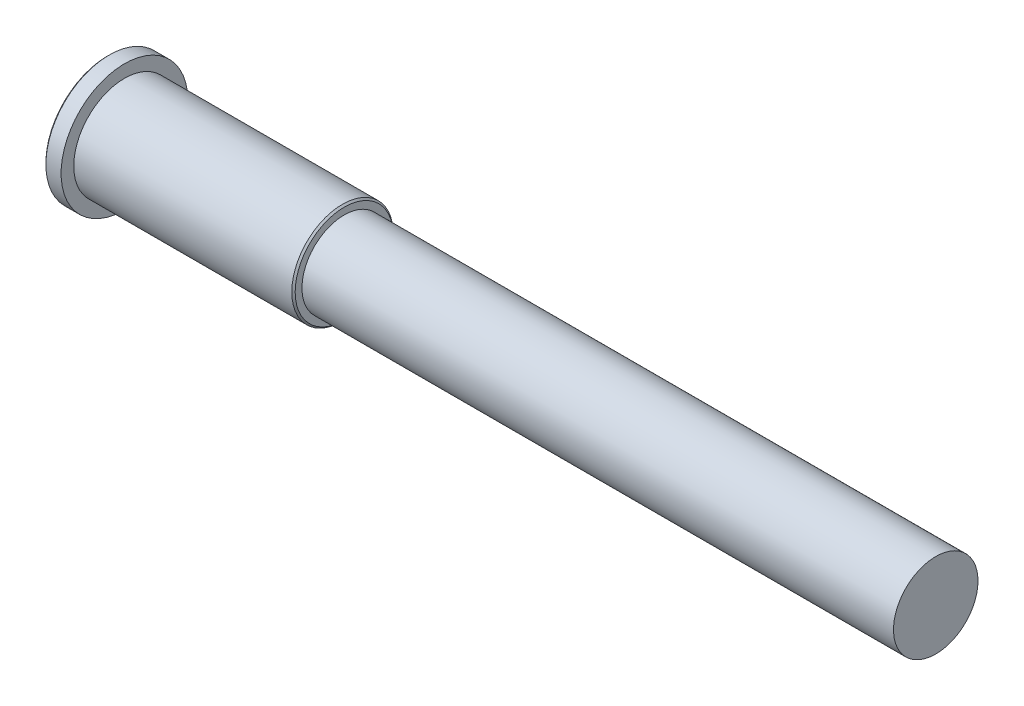
ISO-10303-21;
HEADER;
FILE_DESCRIPTION(('STEP AP214'),'2;1');
FILE_NAME('part.step','',(''),(''),'','','');
FILE_SCHEMA(('AUTOMOTIVE_DESIGN { 1 0 10303 214 1 1 1 1 }'));
ENDSEC;
DATA;
#1=APPLICATION_CONTEXT('core data for automotive mechanical design processes');
#2=APPLICATION_PROTOCOL_DEFINITION('international standard','automotive_design',2000,#1);
#3=PRODUCT_CONTEXT('',#1,'mechanical');
#4=PRODUCT('Part','Part','',(#3));
#5=PRODUCT_RELATED_PRODUCT_CATEGORY('part','',(#4));
#6=PRODUCT_DEFINITION_FORMATION('','',#4);
#7=PRODUCT_DEFINITION_CONTEXT('part definition',#1,'design');
#8=PRODUCT_DEFINITION('design','',#6,#7);
#9=PRODUCT_DEFINITION_SHAPE('','',#8);
#10=(LENGTH_UNIT() NAMED_UNIT(*) SI_UNIT(.MILLI.,.METRE.));
#11=(NAMED_UNIT(*) PLANE_ANGLE_UNIT() SI_UNIT($,.RADIAN.));
#12=(NAMED_UNIT(*) SI_UNIT($,.STERADIAN.) SOLID_ANGLE_UNIT());
#13=UNCERTAINTY_MEASURE_WITH_UNIT(LENGTH_MEASURE(1.E-05),#10,'distance_accuracy_value','');
#14=(GEOMETRIC_REPRESENTATION_CONTEXT(3) GLOBAL_UNCERTAINTY_ASSIGNED_CONTEXT((#13)) GLOBAL_UNIT_ASSIGNED_CONTEXT((#10,
#11,#12)) REPRESENTATION_CONTEXT('',''));
#15=CARTESIAN_POINT('',(0.,0.,0.));
#16=DIRECTION('',(0.,0.,1.));
#17=DIRECTION('',(1.,0.,0.));
#18=AXIS2_PLACEMENT_3D('',#15,#16,#17);
#19=CARTESIAN_POINT('',(30.9757691467533,0.,0.));
#20=DIRECTION('',(-1.,0.,0.));
#21=DIRECTION('',(0.,0.,1.));
#22=AXIS2_PLACEMENT_3D('',#19,#20,#21);
#23=CYLINDRICAL_SURFACE('',#22,2.381739130425);
#24=CARTESIAN_POINT('',(30.4041517554513,0.,0.));
#25=DIRECTION('',(1.,0.,0.));
#26=DIRECTION('',(0.,0.,-1.));
#27=AXIS2_PLACEMENT_3D('',#24,#25,#26);
#28=CIRCLE('',#27,2.381739130425);
#29=CARTESIAN_POINT('',(30.4041517554513,0.,-2.381739130425));
#30=VERTEX_POINT('',#29);
#31=EDGE_CURVE('E53',#30,#30,#28,.T.);
#32=ORIENTED_EDGE('',*,*,#31,.T.);
#33=EDGE_LOOP('',(#32));
#34=FACE_BOUND('',#33,.T.);
#35=CARTESIAN_POINT('',(30.9757691467533,0.,0.));
#36=DIRECTION('',(1.,0.,0.));
#37=DIRECTION('',(0.,0.,-1.));
#38=AXIS2_PLACEMENT_3D('',#35,#36,#37);
#39=CIRCLE('',#38,2.381739130425);
#40=CARTESIAN_POINT('',(30.9757691467533,0.,-2.381739130425));
#41=VERTEX_POINT('',#40);
#42=EDGE_CURVE('E59',#41,#41,#39,.T.);
#43=ORIENTED_EDGE('',*,*,#42,.F.);
#44=EDGE_LOOP('',(#43));
#45=FACE_BOUND('',#44,.T.);
#46=ADVANCED_FACE('F38',(#34,#45),#23,.T.);
#47=CARTESIAN_POINT('',(30.9757691467533,0.,0.));
#48=DIRECTION('',(1.,0.,0.));
#49=DIRECTION('',(0.,0.,-1.));
#50=AXIS2_PLACEMENT_3D('',#47,#48,#49);
#51=PLANE('',#50);
#52=CARTESIAN_POINT('',(30.9757691467533,0.,0.));
#53=DIRECTION('',(1.,0.,0.));
#54=DIRECTION('',(0.,0.,-1.));
#55=AXIS2_PLACEMENT_3D('',#52,#53,#54);
#56=CIRCLE('',#55,1.90539130434);
#57=CARTESIAN_POINT('',(30.9757691467533,0.,1.90539130434));
#58=VERTEX_POINT('',#57);
#59=EDGE_CURVE('E62',#58,#58,#56,.T.);
#60=ORIENTED_EDGE('',*,*,#59,.F.);
#61=EDGE_LOOP('',(#60));
#62=FACE_BOUND('',#61,.T.);
#63=ORIENTED_EDGE('',*,*,#42,.T.);
#64=EDGE_LOOP('',(#63));
#65=FACE_BOUND('',#64,.T.);
#66=ADVANCED_FACE('F89',(#62,#65),#51,.T.);
#67=CARTESIAN_POINT('',(30.3406387119733,0.,0.));
#68=DIRECTION('',(1.,0.,0.));
#69=DIRECTION('',(0.,0.,-1.));
#70=AXIS2_PLACEMENT_3D('',#67,#68,#69);
#71=PLANE('',#70);
#72=CARTESIAN_POINT('',(30.3406387119733,0.,0.));
#73=DIRECTION('',(1.,0.,0.));
#74=DIRECTION('',(0.,0.,-1.));
#75=AXIS2_PLACEMENT_3D('',#72,#73,#74);
#76=CIRCLE('',#75,2.318226086947);
#77=CARTESIAN_POINT('',(30.3406387119733,0.,-2.31822608694699));
#78=VERTEX_POINT('',#77);
#79=EDGE_CURVE('E49',#78,#78,#76,.F.);
#80=ORIENTED_EDGE('',*,*,#79,.T.);
#81=EDGE_LOOP('',(#80));
#82=FACE_BOUND('',#81,.T.);
#83=ADVANCED_FACE('F86',(#82),#71,.F.);
#84=CARTESIAN_POINT('',(39.2324647988933,0.,0.));
#85=DIRECTION('',(-1.,0.,0.));
#86=DIRECTION('',(0.,0.,1.));
#87=AXIS2_PLACEMENT_3D('',#84,#85,#86);
#88=CYLINDRICAL_SURFACE('',#87,1.90539130434);
#89=CARTESIAN_POINT('',(39.1689517554154,0.,0.));
#90=DIRECTION('',(1.,0.,0.));
#91=DIRECTION('',(0.,0.,-1.));
#92=AXIS2_PLACEMENT_3D('',#89,#90,#91);
#93=CIRCLE('',#92,1.90539130434);
#94=CARTESIAN_POINT('',(39.1689517554154,0.,1.90539130434));
#95=VERTEX_POINT('',#94);
#96=EDGE_CURVE('E10',#95,#95,#93,.F.);
#97=CARTESIAN_POINT('',(39.1689517554154,0.,1.90539130434));
#98=CARTESIAN_POINT('',(39.0836061032418,0.,1.90539130434));
#99=CARTESIAN_POINT('',(38.9982604510682,0.,1.90539130434));
#100=CARTESIAN_POINT('',(38.8275691467211,0.,1.90539130434));
#101=CARTESIAN_POINT('',(38.7422234945475,0.,1.90539130434));
#102=CARTESIAN_POINT('',(38.5715321902004,0.,1.90539130434));
#103=CARTESIAN_POINT('',(38.4861865380269,0.,1.90539130434));
#104=CARTESIAN_POINT('',(38.3154952336797,0.,1.90539130434));
#105=CARTESIAN_POINT('',(38.2301495815062,0.,1.90539130434));
#106=CARTESIAN_POINT('',(38.059458277159,0.,1.90539130434));
#107=CARTESIAN_POINT('',(37.9741126249855,0.,1.90539130434));
#108=CARTESIAN_POINT('',(37.8034213206383,0.,1.90539130434));
#109=CARTESIAN_POINT('',(37.7180756684648,0.,1.90539130434));
#110=CARTESIAN_POINT('',(37.5473843641177,0.,1.90539130434));
#111=CARTESIAN_POINT('',(37.4620387119441,0.,1.90539130434));
#112=CARTESIAN_POINT('',(37.291347407597,0.,1.90539130434));
#113=CARTESIAN_POINT('',(37.2060017554234,0.,1.90539130434));
#114=CARTESIAN_POINT('',(37.0353104510763,0.,1.90539130434));
#115=CARTESIAN_POINT('',(36.9499647989027,0.,1.90539130434));
#116=CARTESIAN_POINT('',(36.7792734945556,0.,1.90539130434));
#117=CARTESIAN_POINT('',(36.693927842382,0.,1.90539130434));
#118=CARTESIAN_POINT('',(36.5232365380349,0.,1.90539130434));
#119=CARTESIAN_POINT('',(36.4378908858613,0.,1.90539130434));
#120=CARTESIAN_POINT('',(36.2671995815142,0.,1.90539130434));
#121=CARTESIAN_POINT('',(36.1818539293407,0.,1.90539130434));
#122=CARTESIAN_POINT('',(36.0111626249935,0.,1.90539130434));
#123=CARTESIAN_POINT('',(35.92581697282,0.,1.90539130434));
#124=CARTESIAN_POINT('',(35.7551256684729,0.,1.90539130434));
#125=CARTESIAN_POINT('',(35.6697800162993,0.,1.90539130434));
#126=CARTESIAN_POINT('',(35.4990887119522,0.,1.90539130434));
#127=CARTESIAN_POINT('',(35.4137430597786,0.,1.90539130434));
#128=CARTESIAN_POINT('',(35.2430517554315,0.,1.90539130434));
#129=CARTESIAN_POINT('',(35.1577061032579,0.,1.90539130434));
#130=CARTESIAN_POINT('',(34.9870147989108,0.,1.90539130434));
#131=CARTESIAN_POINT('',(34.9016691467372,0.,1.90539130434));
#132=CARTESIAN_POINT('',(34.7309778423901,0.,1.90539130434));
#133=CARTESIAN_POINT('',(34.6456321902165,0.,1.90539130434));
#134=CARTESIAN_POINT('',(34.4749408858694,0.,1.90539130434));
#135=CARTESIAN_POINT('',(34.3895952336959,0.,1.90539130434));
#136=CARTESIAN_POINT('',(34.2189039293487,0.,1.90539130434));
#137=CARTESIAN_POINT('',(34.1335582771752,0.,1.90539130434));
#138=CARTESIAN_POINT('',(33.962866972828,0.,1.90539130434));
#139=CARTESIAN_POINT('',(33.8775213206545,0.,1.90539130434));
#140=CARTESIAN_POINT('',(33.7068300163073,0.,1.90539130434));
#141=CARTESIAN_POINT('',(33.6214843641338,0.,1.90539130434));
#142=CARTESIAN_POINT('',(33.4507930597867,0.,1.90539130434));
#143=CARTESIAN_POINT('',(33.3654474076131,0.,1.90539130434));
#144=CARTESIAN_POINT('',(33.194756103266,0.,1.90539130434));
#145=CARTESIAN_POINT('',(33.1094104510924,0.,1.90539130434));
#146=CARTESIAN_POINT('',(32.9387191467453,0.,1.90539130434));
#147=CARTESIAN_POINT('',(32.8533734945717,0.,1.90539130434));
#148=CARTESIAN_POINT('',(32.6826821902246,0.,1.90539130434));
#149=CARTESIAN_POINT('',(32.597336538051,0.,1.90539130434));
#150=CARTESIAN_POINT('',(32.4266452337039,0.,1.90539130434));
#151=CARTESIAN_POINT('',(32.3412995815303,0.,1.90539130434));
#152=CARTESIAN_POINT('',(32.1706082771832,0.,1.90539130434));
#153=CARTESIAN_POINT('',(32.0852626250097,0.,1.90539130434));
#154=CARTESIAN_POINT('',(31.9145713206625,0.,1.90539130434));
#155=CARTESIAN_POINT('',(31.829225668489,0.,1.90539130434));
#156=CARTESIAN_POINT('',(31.6585343641418,0.,1.90539130434));
#157=CARTESIAN_POINT('',(31.5731887119683,0.,1.90539130434));
#158=CARTESIAN_POINT('',(31.4024974076211,0.,1.90539130434));
#159=CARTESIAN_POINT('',(31.3171517554476,0.,1.90539130434));
#160=CARTESIAN_POINT('',(31.1464604511005,0.,1.90539130434));
#161=CARTESIAN_POINT('',(31.0611147989269,0.,1.90539130434));
#162=CARTESIAN_POINT('',(30.9757691467533,0.,1.90539130434));
#163=B_SPLINE_CURVE_WITH_KNOTS('',3,(#97,#98,#99,#100,#101,#102,#103,#104,#105,#106,#107,#108,
#109,#110,#111,#112,#113,#114,#115,#116,#117,#118,#119,#120,#121,#122,#123,#124,#125,#126,#127,
#128,#129,#130,#131,#132,#133,#134,#135,#136,#137,#138,#139,#140,#141,#142,#143,#144,#145,#146,
#147,#148,#149,#150,#151,#152,#153,#154,#155,#156,#157,#158,#159,#160,#161,#162),.UNSPECIFIED.,
.F.,.F.,(4,2,2,2,2,2,2,2,2,2,2,2,2,2,2,2,2,2,2,2,2,2,2,2,2,2,2,2,2,2,2,2,4),(0.,
0.256036956520683,0.512073913041373,0.768110869562064,1.02414782608275,1.28018478260344,
1.53622173912413,1.79225869564482,2.0482956521655,2.30433260868619,2.56036956520688,
2.81640652172756,3.07244347824825,3.32848043476894,3.58451739128963,3.84055434781032,
4.09659130433101,4.3526282608517,4.60866521737238,4.86470217389307,5.12073913041376,
5.37677608693445,5.63281304345514,5.88884999997583,6.14488695649652,6.4009239130172,
6.65696086953789,6.91299782605858,7.16903478257926,7.42507173909995,7.68110869562064,
7.93714565214133,8.19318260866202),.UNSPECIFIED.);
#164=EDGE_CURVE('BSEAM81',#95,#58,#163,.T.);
#165=ORIENTED_EDGE('',*,*,#96,.T.);
#166=ORIENTED_EDGE('',*,*,#59,.T.);
#167=ORIENTED_EDGE('',*,*,#164,.T.);
#168=ORIENTED_EDGE('',*,*,#164,.F.);
#169=EDGE_LOOP('',(#165,#167,#166,#168));
#170=FACE_BOUND('',#169,.T.);
#171=ADVANCED_FACE('F81',(#170),#88,.T.);
#172=CARTESIAN_POINT('',(39.2324647988933,0.,0.));
#173=DIRECTION('',(1.,0.,0.));
#174=DIRECTION('',(0.,0.,-1.));
#175=AXIS2_PLACEMENT_3D('',#172,#173,#174);
#176=PLANE('',#175);
#177=CARTESIAN_POINT('',(39.2324647988933,0.,0.));
#178=DIRECTION('',(1.,0.,0.));
#179=DIRECTION('',(0.,0.,-1.));
#180=AXIS2_PLACEMENT_3D('',#177,#178,#179);
#181=CIRCLE('',#180,1.84187826086202);
#182=CARTESIAN_POINT('',(39.2324647988933,0.,1.84187826086202));
#183=VERTEX_POINT('',#182);
#184=EDGE_CURVE('E45',#183,#183,#181,.T.);
#185=ORIENTED_EDGE('',*,*,#184,.T.);
#186=EDGE_LOOP('',(#185));
#187=FACE_BOUND('',#186,.T.);
#188=CARTESIAN_POINT('',(39.2324647988933,0.,0.));
#189=DIRECTION('',(1.,0.,0.));
#190=DIRECTION('',(0.,0.,-1.));
#191=AXIS2_PLACEMENT_3D('',#188,#189,#190);
#192=CIRCLE('',#191,1.58782608695);
#193=CARTESIAN_POINT('',(39.2324647988933,0.,-1.58782608695));
#194=VERTEX_POINT('',#193);
#195=EDGE_CURVE('E58',#194,#194,#192,.T.);
#196=ORIENTED_EDGE('',*,*,#195,.F.);
#197=EDGE_LOOP('',(#196));
#198=FACE_BOUND('',#197,.T.);
#199=ADVANCED_FACE('F76',(#187,#198),#176,.T.);
#200=CARTESIAN_POINT('',(61.4620300161933,0.,0.));
#201=DIRECTION('',(-1.,0.,0.));
#202=DIRECTION('',(0.,0.,1.));
#203=AXIS2_PLACEMENT_3D('',#200,#201,#202);
#204=CYLINDRICAL_SURFACE('',#203,1.58782608695);
#205=CARTESIAN_POINT('',(61.4620300161933,0.,0.));
#206=DIRECTION('',(1.,0.,0.));
#207=DIRECTION('',(0.,0.,-1.));
#208=AXIS2_PLACEMENT_3D('',#205,#206,#207);
#209=CIRCLE('',#208,1.58782608695);
#210=CARTESIAN_POINT('',(61.4620300161933,0.,-1.58782608695));
#211=VERTEX_POINT('',#210);
#212=EDGE_CURVE('E63',#211,#211,#209,.T.);
#213=ORIENTED_EDGE('',*,*,#212,.F.);
#214=EDGE_LOOP('',(#213));
#215=FACE_BOUND('',#214,.T.);
#216=ORIENTED_EDGE('',*,*,#195,.T.);
#217=EDGE_LOOP('',(#216));
#218=FACE_BOUND('',#217,.T.);
#219=ADVANCED_FACE('F73',(#215,#218),#204,.T.);
#220=CARTESIAN_POINT('',(61.4620300161933,0.,0.));
#221=DIRECTION('',(1.,0.,0.));
#222=DIRECTION('',(0.,0.,-1.));
#223=AXIS2_PLACEMENT_3D('',#220,#221,#222);
#224=PLANE('',#223);
#225=ORIENTED_EDGE('',*,*,#212,.T.);
#226=EDGE_LOOP('',(#225));
#227=FACE_BOUND('',#226,.T.);
#228=ADVANCED_FACE('F71',(#227),#224,.T.);
#229=CARTESIAN_POINT('',(30.4041517554513,0.,0.));
#230=DIRECTION('',(1.,0.,0.));
#231=DIRECTION('',(0.,0.,-1.));
#232=AXIS2_PLACEMENT_3D('',#229,#230,#231);
#233=CONICAL_SURFACE('',#232,2.381739130425,0.785398163397444);
#234=CARTESIAN_POINT('',(30.3406387119733,0.,-2.31822608694699));
#235=CARTESIAN_POINT('',(30.3413003061762,0.,-2.31888768114989));
#236=CARTESIAN_POINT('',(30.3419619003791,0.,-2.31954927535279));
#237=CARTESIAN_POINT('',(30.3432850887849,0.,-2.32087246375858));
#238=CARTESIAN_POINT('',(30.3439466829878,0.,-2.32153405796147));
#239=CARTESIAN_POINT('',(30.3452698713936,0.,-2.32285724636727));
#240=CARTESIAN_POINT('',(30.3459314655965,0.,-2.32351884057016));
#241=CARTESIAN_POINT('',(30.3472546540023,0.,-2.32484202897595));
#242=CARTESIAN_POINT('',(30.3479162482052,0.,-2.32550362317885));
#243=CARTESIAN_POINT('',(30.349239436611,0.,-2.32682681158464));
#244=CARTESIAN_POINT('',(30.3499010308139,0.,-2.32748840578754));
#245=CARTESIAN_POINT('',(30.3512242192197,0.,-2.32881159419333));
#246=CARTESIAN_POINT('',(30.3518858134226,0.,-2.32947318839622));
#247=CARTESIAN_POINT('',(30.3532090018284,0.,-2.33079637680202));
#248=CARTESIAN_POINT('',(30.3538705960313,0.,-2.33145797100491));
#249=CARTESIAN_POINT('',(30.355193784437,0.,-2.3327811594107));
#250=CARTESIAN_POINT('',(30.3558553786399,0.,-2.3334427536136));
#251=CARTESIAN_POINT('',(30.3571785670457,0.,-2.33476594201939));
#252=CARTESIAN_POINT('',(30.3578401612486,0.,-2.33542753622229));
#253=CARTESIAN_POINT('',(30.3591633496544,0.,-2.33675072462808));
#254=CARTESIAN_POINT('',(30.3598249438573,0.,-2.33741231883097));
#255=CARTESIAN_POINT('',(30.3611481322631,0.,-2.33873550723677));
#256=CARTESIAN_POINT('',(30.361809726466,0.,-2.33939710143966));
#257=CARTESIAN_POINT('',(30.3631329148718,0.,-2.34072028984545));
#258=CARTESIAN_POINT('',(30.3637945090747,0.,-2.34138188404835));
#259=CARTESIAN_POINT('',(30.3651176974805,0.,-2.34270507245414));
#260=CARTESIAN_POINT('',(30.3657792916834,0.,-2.34336666665704));
#261=CARTESIAN_POINT('',(30.3671024800892,0.,-2.34468985506283));
#262=CARTESIAN_POINT('',(30.3677640742921,0.,-2.34535144926573));
#263=CARTESIAN_POINT('',(30.3690872626979,0.,-2.34667463767152));
#264=CARTESIAN_POINT('',(30.3697488569008,0.,-2.34733623187441));
#265=CARTESIAN_POINT('',(30.3710720453065,0.,-2.3486594202802));
#266=CARTESIAN_POINT('',(30.3717336395094,0.,-2.3493210144831));
#267=CARTESIAN_POINT('',(30.3730568279152,0.,-2.35064420288889));
#268=CARTESIAN_POINT('',(30.3737184221181,0.,-2.35130579709179));
#269=CARTESIAN_POINT('',(30.3750416105239,0.,-2.35262898549758));
#270=CARTESIAN_POINT('',(30.3757032047268,0.,-2.35329057970048));
#271=CARTESIAN_POINT('',(30.3770263931326,0.,-2.35461376810627));
#272=CARTESIAN_POINT('',(30.3776879873355,0.,-2.35527536230916));
#273=CARTESIAN_POINT('',(30.3790111757413,0.,-2.35659855071495));
#274=CARTESIAN_POINT('',(30.3796727699442,0.,-2.35726014491785));
#275=CARTESIAN_POINT('',(30.38099595835,0.,-2.35858333332364));
#276=CARTESIAN_POINT('',(30.3816575525529,0.,-2.35924492752654));
#277=CARTESIAN_POINT('',(30.3829807409587,0.,-2.36056811593233));
#278=CARTESIAN_POINT('',(30.3836423351616,0.,-2.36122971013523));
#279=CARTESIAN_POINT('',(30.3849655235674,0.,-2.36255289854102));
#280=CARTESIAN_POINT('',(30.3856271177703,0.,-2.36321449274391));
#281=CARTESIAN_POINT('',(30.386950306176,0.,-2.3645376811497));
#282=CARTESIAN_POINT('',(30.3876119003789,0.,-2.3651992753526));
#283=CARTESIAN_POINT('',(30.3889350887847,0.,-2.36652246375839));
#284=CARTESIAN_POINT('',(30.3895966829876,0.,-2.36718405796129));
#285=CARTESIAN_POINT('',(30.3909198713934,0.,-2.36850724636708));
#286=CARTESIAN_POINT('',(30.3915814655963,0.,-2.36916884056998));
#287=CARTESIAN_POINT('',(30.3929046540021,0.,-2.37049202897577));
#288=CARTESIAN_POINT('',(30.393566248205,0.,-2.37115362317866));
#289=CARTESIAN_POINT('',(30.3948894366108,0.,-2.37247681158446));
#290=CARTESIAN_POINT('',(30.3955510308137,0.,-2.37313840578735));
#291=CARTESIAN_POINT('',(30.3968742192195,0.,-2.37446159419314));
#292=CARTESIAN_POINT('',(30.3975358134224,0.,-2.37512318839604));
#293=CARTESIAN_POINT('',(30.3988590018282,0.,-2.37644637680183));
#294=CARTESIAN_POINT('',(30.3995205960311,0.,-2.37710797100473));
#295=CARTESIAN_POINT('',(30.4008437844369,0.,-2.37843115941052));
#296=CARTESIAN_POINT('',(30.4015053786398,0.,-2.37909275361341));
#297=CARTESIAN_POINT('',(30.4028285670455,0.,-2.38041594201921));
#298=CARTESIAN_POINT('',(30.4034901612484,0.,-2.3810775362221));
#299=CARTESIAN_POINT('',(30.4041517554513,0.,-2.381739130425));
#300=B_SPLINE_CURVE_WITH_KNOTS('',3,(#234,#235,#236,#237,#238,#239,#240,#241,#242,#243,#244,
#245,#246,#247,#248,#249,#250,#251,#252,#253,#254,#255,#256,#257,#258,#259,#260,#261,#262,#263,
#264,#265,#266,#267,#268,#269,#270,#271,#272,#273,#274,#275,#276,#277,#278,#279,#280,#281,#282,
#283,#284,#285,#286,#287,#288,#289,#290,#291,#292,#293,#294,#295,#296,#297,#298,#299),
.UNSPECIFIED.,.F.,.F.,(4,2,2,2,2,2,2,2,2,2,2,2,2,2,2,2,2,2,2,2,2,2,2,2,2,2,2,2,2,2,2,2,4),(0.,
0.00280690648356965,0.00561381296713716,0.00842071945070681,0.011227625934274,
0.0140345324178437,0.0168414389014109,0.0196483453849784,0.022455251868548,0.0252621583521152,
0.0280690648356849,0.0308759713192524,0.0336828778028196,0.0364897842863892,0.0392966907699564,
0.0421035972535261,0.0449105037370936,0.0477174102206608,0.0505243167042304,0.0533312231877976,
0.0561381296713673,0.0589450361549348,0.061751942638502,0.0645588491220717,0.0673657556056389,
0.0701726620892088,0.072979568572776,0.0757864750563432,0.0785933815399129,0.0814002880234801,
0.0842071945070501,0.0870141009906173,0.0898210074741869),.UNSPECIFIED.);
#301=EDGE_CURVE('BSEAM99',#78,#30,#300,.T.);
#302=ORIENTED_EDGE('',*,*,#79,.F.);
#303=ORIENTED_EDGE('',*,*,#31,.F.);
#304=ORIENTED_EDGE('',*,*,#301,.T.);
#305=ORIENTED_EDGE('',*,*,#301,.F.);
#306=EDGE_LOOP('',(#302,#304,#303,#305));
#307=FACE_BOUND('',#306,.T.);
#308=ADVANCED_FACE('F99',(#307),#233,.T.);
#309=CARTESIAN_POINT('',(39.2324647988933,0.,0.));
#310=DIRECTION('',(-1.,0.,0.));
#311=DIRECTION('',(0.,0.,1.));
#312=AXIS2_PLACEMENT_3D('',#309,#310,#311);
#313=CONICAL_SURFACE('',#312,1.84187826086202,0.785398163397474);
#314=CARTESIAN_POINT('',(39.1689517554154,0.,1.90539130434));
#315=CARTESIAN_POINT('',(39.1696133496183,0.,1.9047297101371));
#316=CARTESIAN_POINT('',(39.1702749438211,0.,1.90406811593421));
#317=CARTESIAN_POINT('',(39.1715981322269,0.,1.90274492752842));
#318=CARTESIAN_POINT('',(39.1722597264298,0.,1.90208333332552));
#319=CARTESIAN_POINT('',(39.1735829148356,0.,1.90076014491973));
#320=CARTESIAN_POINT('',(39.1742445090385,0.,1.90009855071684));
#321=CARTESIAN_POINT('',(39.1755676974443,0.,1.89877536231104));
#322=CARTESIAN_POINT('',(39.1762292916472,0.,1.89811376810815));
#323=CARTESIAN_POINT('',(39.177552480053,0.,1.89679057970236));
#324=CARTESIAN_POINT('',(39.1782140742559,0.,1.89612898549946));
#325=CARTESIAN_POINT('',(39.1795372626617,0.,1.89480579709367));
#326=CARTESIAN_POINT('',(39.1801988568646,0.,1.89414420289078));
#327=CARTESIAN_POINT('',(39.1815220452704,0.,1.89282101448499));
#328=CARTESIAN_POINT('',(39.1821836394733,0.,1.89215942028209));
#329=CARTESIAN_POINT('',(39.1835068278791,0.,1.8908362318763));
#330=CARTESIAN_POINT('',(39.184168422082,0.,1.8901746376734));
#331=CARTESIAN_POINT('',(39.1854916104877,0.,1.88885144926761));
#332=CARTESIAN_POINT('',(39.1861532046906,0.,1.88818985506472));
#333=CARTESIAN_POINT('',(39.1874763930964,0.,1.88686666665892));
#334=CARTESIAN_POINT('',(39.1881379872993,0.,1.88620507245603));
#335=CARTESIAN_POINT('',(39.1894611757051,0.,1.88488188405024));
#336=CARTESIAN_POINT('',(39.190122769908,0.,1.88422028984734));
#337=CARTESIAN_POINT('',(39.1914459583138,0.,1.88289710144155));
#338=CARTESIAN_POINT('',(39.1921075525167,0.,1.88223550723865));
#339=CARTESIAN_POINT('',(39.1934307409225,0.,1.88091231883286));
#340=CARTESIAN_POINT('',(39.1940923351254,0.,1.88025072462997));
#341=CARTESIAN_POINT('',(39.1954155235312,0.,1.87892753622418));
#342=CARTESIAN_POINT('',(39.1960771177341,0.,1.87826594202128));
#343=CARTESIAN_POINT('',(39.1974003061399,0.,1.87694275361549));
#344=CARTESIAN_POINT('',(39.1980619003428,0.,1.8762811594126));
#345=CARTESIAN_POINT('',(39.1993850887486,0.,1.8749579710068));
#346=CARTESIAN_POINT('',(39.2000466829514,0.,1.87429637680391));
#347=CARTESIAN_POINT('',(39.2013698713572,0.,1.87297318839812));
#348=CARTESIAN_POINT('',(39.2020314655601,0.,1.87231159419522));
#349=CARTESIAN_POINT('',(39.2033546539659,0.,1.87098840578943));
#350=CARTESIAN_POINT('',(39.2040162481688,0.,1.87032681158654));
#351=CARTESIAN_POINT('',(39.2053394365746,0.,1.86900362318074));
#352=CARTESIAN_POINT('',(39.2060010307775,0.,1.86834202897785));
#353=CARTESIAN_POINT('',(39.2073242191833,0.,1.86701884057206));
#354=CARTESIAN_POINT('',(39.2079858133862,0.,1.86635724636916));
#355=CARTESIAN_POINT('',(39.209309001792,0.,1.86503405796337));
#356=CARTESIAN_POINT('',(39.2099705959949,0.,1.86437246376047));
#357=CARTESIAN_POINT('',(39.2112937844007,0.,1.86304927535468));
#358=CARTESIAN_POINT('',(39.2119553786036,0.,1.86238768115179));
#359=CARTESIAN_POINT('',(39.2132785670094,0.,1.861064492746));
#360=CARTESIAN_POINT('',(39.2139401612123,0.,1.8604028985431));
#361=CARTESIAN_POINT('',(39.215263349618,0.,1.85907971013731));
#362=CARTESIAN_POINT('',(39.2159249438209,0.,1.85841811593441));
#363=CARTESIAN_POINT('',(39.2172481322267,0.,1.85709492752862));
#364=CARTESIAN_POINT('',(39.2179097264296,0.,1.85643333332573));
#365=CARTESIAN_POINT('',(39.2192329148354,0.,1.85511014491994));
#366=CARTESIAN_POINT('',(39.2198945090383,0.,1.85444855071704));
#367=CARTESIAN_POINT('',(39.2212176974441,0.,1.85312536231125));
#368=CARTESIAN_POINT('',(39.221879291647,0.,1.85246376810835));
#369=CARTESIAN_POINT('',(39.2232024800528,0.,1.85114057970256));
#370=CARTESIAN_POINT('',(39.2238640742557,0.,1.85047898549967));
#371=CARTESIAN_POINT('',(39.2251872626615,0.,1.84915579709388));
#372=CARTESIAN_POINT('',(39.2258488568644,0.,1.84849420289098));
#373=CARTESIAN_POINT('',(39.2271720452702,0.,1.84717101448519));
#374=CARTESIAN_POINT('',(39.2278336394731,0.,1.84650942028229));
#375=CARTESIAN_POINT('',(39.2291568278789,0.,1.8451862318765));
#376=CARTESIAN_POINT('',(39.2298184220817,0.,1.84452463767361));
#377=CARTESIAN_POINT('',(39.2311416104875,0.,1.84320144926782));
#378=CARTESIAN_POINT('',(39.2318032046904,0.,1.84253985506492));
#379=CARTESIAN_POINT('',(39.2324647988933,0.,1.84187826086202));
#380=B_SPLINE_CURVE_WITH_KNOTS('',3,(#314,#315,#316,#317,#318,#319,#320,#321,#322,#323,#324,
#325,#326,#327,#328,#329,#330,#331,#332,#333,#334,#335,#336,#337,#338,#339,#340,#341,#342,#343,
#344,#345,#346,#347,#348,#349,#350,#351,#352,#353,#354,#355,#356,#357,#358,#359,#360,#361,#362,
#363,#364,#365,#366,#367,#368,#369,#370,#371,#372,#373,#374,#375,#376,#377,#378,#379),
.UNSPECIFIED.,.F.,.F.,(4,2,2,2,2,2,2,2,2,2,2,2,2,2,2,2,2,2,2,2,2,2,2,2,2,2,2,2,2,2,2,2,4),(0.,
0.00280690648356904,0.00561381296713823,0.00842071945070237,0.0112276259342716,
0.0140345324178357,0.0168414389014049,0.019648345384969,0.0224552518685381,0.0252621583521072,
0.0280690648356714,0.0308759713192406,0.0336828778028047,0.0364897842863739,0.039296690769938,
0.0421035972535072,0.0449105037370714,0.0477174102206405,0.0505243167042096,0.0533312231877739,
0.0561381296713429,0.0589450361549072,0.0617519426384762,0.0645588491220405,0.0673657556056096,
0.0701726620891788,0.0729795685727429,0.0757864750563121,0.0785933815398762,0.0814002880234454,
0.0842071945070095,0.0870141009905787,0.0898210074741478),.UNSPECIFIED.);
#381=EDGE_CURVE('BSEAM40',#95,#183,#380,.T.);
#382=ORIENTED_EDGE('',*,*,#96,.F.);
#383=ORIENTED_EDGE('',*,*,#184,.F.);
#384=ORIENTED_EDGE('',*,*,#381,.T.);
#385=ORIENTED_EDGE('',*,*,#381,.F.);
#386=EDGE_LOOP('',(#382,#384,#383,#385));
#387=FACE_BOUND('',#386,.T.);
#388=ADVANCED_FACE('F40',(#387),#313,.T.);
#389=CLOSED_SHELL('',(#46,#66,#83,#171,#199,#219,#228,#308,#388));
#390=MANIFOLD_SOLID_BREP('B2',#389);
#391=ADVANCED_BREP_SHAPE_REPRESENTATION('',(#18,#390),#14);
#392=SHAPE_DEFINITION_REPRESENTATION(#9,#391);
ENDSEC;
END-ISO-10303-21;
